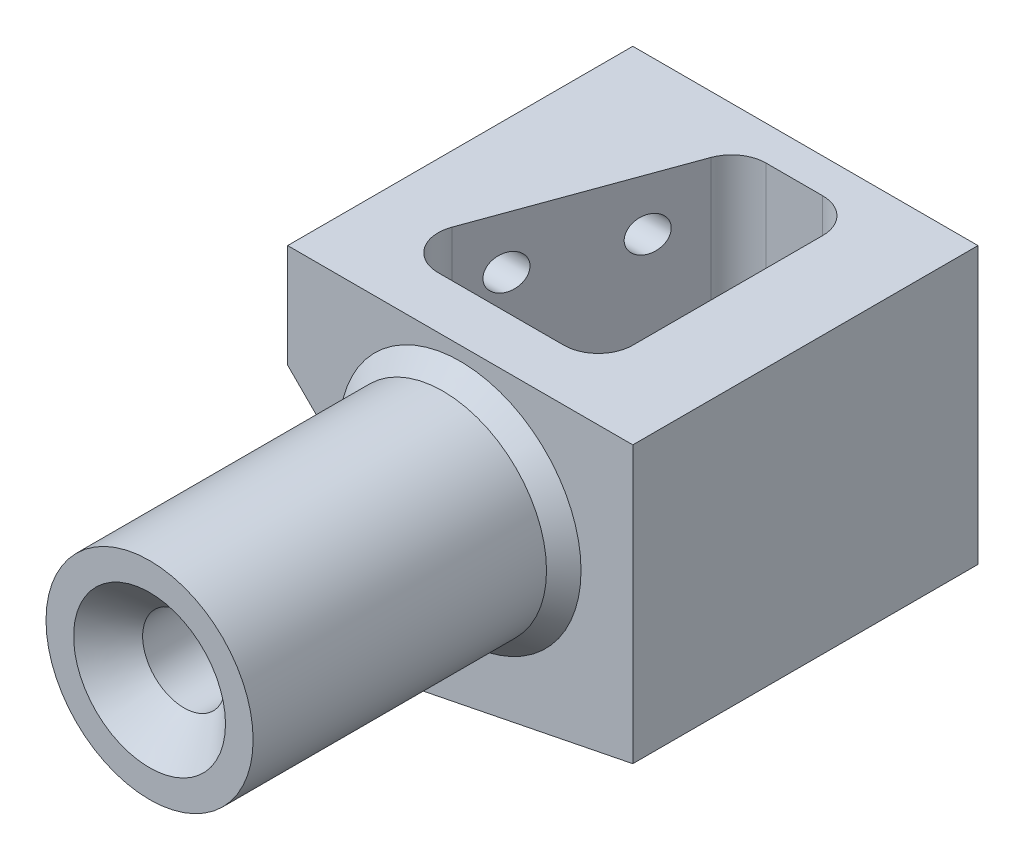
ISO-10303-21;
HEADER;
FILE_DESCRIPTION(('STEP AP214'),'2;1');
FILE_NAME('part.step','',(''),(''),'','','');
FILE_SCHEMA(('AUTOMOTIVE_DESIGN { 1 0 10303 214 1 1 1 1 }'));
ENDSEC;
DATA;
#1=APPLICATION_CONTEXT('core data for automotive mechanical design processes');
#2=APPLICATION_PROTOCOL_DEFINITION('international standard','automotive_design',2000,#1);
#3=PRODUCT_CONTEXT('',#1,'mechanical');
#4=PRODUCT('Part','Part','',(#3));
#5=PRODUCT_RELATED_PRODUCT_CATEGORY('part','',(#4));
#6=PRODUCT_DEFINITION_FORMATION('','',#4);
#7=PRODUCT_DEFINITION_CONTEXT('part definition',#1,'design');
#8=PRODUCT_DEFINITION('design','',#6,#7);
#9=PRODUCT_DEFINITION_SHAPE('','',#8);
#10=(LENGTH_UNIT() NAMED_UNIT(*) SI_UNIT(.MILLI.,.METRE.));
#11=(NAMED_UNIT(*) PLANE_ANGLE_UNIT() SI_UNIT($,.RADIAN.));
#12=(NAMED_UNIT(*) SI_UNIT($,.STERADIAN.) SOLID_ANGLE_UNIT());
#13=UNCERTAINTY_MEASURE_WITH_UNIT(LENGTH_MEASURE(1.E-05),#10,'distance_accuracy_value','');
#14=(GEOMETRIC_REPRESENTATION_CONTEXT(3) GLOBAL_UNCERTAINTY_ASSIGNED_CONTEXT((#13)) GLOBAL_UNIT_ASSIGNED_CONTEXT((#10,
#11,#12)) REPRESENTATION_CONTEXT('',''));
#15=CARTESIAN_POINT('',(0.,0.,0.));
#16=DIRECTION('',(0.,0.,1.));
#17=DIRECTION('',(1.,0.,0.));
#18=AXIS2_PLACEMENT_3D('',#15,#16,#17);
#19=CARTESIAN_POINT('',(0.,5.00000000000003,-10.));
#20=DIRECTION('',(0.,-1.,0.));
#21=DIRECTION('',(0.,0.,-1.));
#22=AXIS2_PLACEMENT_3D('',#19,#20,#21);
#23=PLANE('',#22);
#24=DIRECTION('',(1.,0.,0.));
#25=VECTOR('',#24,1.);
#26=CARTESIAN_POINT('',(0.,5.00000000000003,0.));
#27=LINE('',#26,#25);
#28=CARTESIAN_POINT('',(-4.99999999999998,5.00000000000003,0.));
#29=VERTEX_POINT('',#28);
#30=CARTESIAN_POINT('',(5.00000000000002,5.00000000000003,0.));
#31=VERTEX_POINT('',#30);
#32=EDGE_CURVE('E222',#29,#31,#27,.T.);
#33=ORIENTED_EDGE('',*,*,#32,.T.);
#34=DIRECTION('',(0.,0.,1.));
#35=VECTOR('',#34,1.);
#36=CARTESIAN_POINT('',(5.00000000000002,5.00000000000003,-10.));
#37=LINE('',#36,#35);
#38=CARTESIAN_POINT('',(5.00000000000002,5.00000000000003,-10.));
#39=VERTEX_POINT('',#38);
#40=EDGE_CURVE('E270',#39,#31,#37,.T.);
#41=ORIENTED_EDGE('',*,*,#40,.F.);
#42=DIRECTION('',(1.,0.,0.));
#43=VECTOR('',#42,1.);
#44=CARTESIAN_POINT('',(0.,5.00000000000003,-10.));
#45=LINE('',#44,#43);
#46=CARTESIAN_POINT('',(-4.99999999999998,5.00000000000003,-10.));
#47=VERTEX_POINT('',#46);
#48=EDGE_CURVE('E225',#47,#39,#45,.T.);
#49=ORIENTED_EDGE('',*,*,#48,.F.);
#50=DIRECTION('',(0.,0.,1.));
#51=VECTOR('',#50,1.);
#52=CARTESIAN_POINT('',(-4.99999999999998,5.00000000000003,-10.));
#53=LINE('',#52,#51);
#54=EDGE_CURVE('E242',#47,#29,#53,.T.);
#55=ORIENTED_EDGE('',*,*,#54,.T.);
#56=EDGE_LOOP('',(#33,#41,#49,#55));
#57=FACE_BOUND('',#56,.T.);
#58=CARTESIAN_POINT('',(1.5,5.00000000000003,-2.5));
#59=DIRECTION('',(0.,1.,0.));
#60=DIRECTION('',(0.,0.,-1.));
#61=AXIS2_PLACEMENT_3D('',#58,#59,#60);
#62=CIRCLE('',#61,1.);
#63=CARTESIAN_POINT('',(1.49999999999999,5.00000000000003,-1.5));
#64=VERTEX_POINT('',#63);
#65=CARTESIAN_POINT('',(2.5,5.00000000000003,-2.50000000000001));
#66=VERTEX_POINT('',#65);
#67=EDGE_CURVE('E68',#64,#66,#62,.T.);
#68=ORIENTED_EDGE('',*,*,#67,.F.);
#69=DIRECTION('',(1.,0.,0.));
#70=VECTOR('',#69,1.);
#71=CARTESIAN_POINT('',(0.,5.00000000000003,-1.5));
#72=LINE('',#71,#70);
#73=CARTESIAN_POINT('',(-2.14222201011317,5.00000000000003,-1.5));
#74=VERTEX_POINT('',#73);
#75=EDGE_CURVE('E194',#74,#64,#72,.T.);
#76=ORIENTED_EDGE('',*,*,#75,.F.);
#77=CARTESIAN_POINT('',(-2.14222201011317,5.00000000000003,-2.5));
#78=DIRECTION('',(0.,1.,0.));
#79=DIRECTION('',(0.,0.,1.));
#80=AXIS2_PLACEMENT_3D('',#77,#78,#79);
#81=CIRCLE('',#80,1.);
#82=CARTESIAN_POINT('',(-3.08191463089908,5.00000000000003,-2.84202014332568));
#83=VERTEX_POINT('',#82);
#84=EDGE_CURVE('E190',#83,#74,#81,.T.);
#85=ORIENTED_EDGE('',*,*,#84,.F.);
#86=DIRECTION('',(-0.342020143325669,0.,0.939692620785908));
#87=VECTOR('',#86,1.);
#88=CARTESIAN_POINT('',(-1.08007834243496,5.00000000000003,-8.34202014332567));
#89=LINE('',#88,#87);
#90=CARTESIAN_POINT('',(-1.08007834243496,5.00000000000003,-8.34202014332567));
#91=VERTEX_POINT('',#90);
#92=EDGE_CURVE('E184',#91,#83,#89,.T.);
#93=ORIENTED_EDGE('',*,*,#92,.F.);
#94=CARTESIAN_POINT('',(-0.140385721649054,5.00000000000003,-8.));
#95=DIRECTION('',(0.,1.,0.));
#96=DIRECTION('',(0.,0.,1.));
#97=AXIS2_PLACEMENT_3D('',#94,#95,#96);
#98=CIRCLE('',#97,1.);
#99=CARTESIAN_POINT('',(-0.140385721649049,5.00000000000003,-9.));
#100=VERTEX_POINT('',#99);
#101=EDGE_CURVE('E179',#100,#91,#98,.T.);
#102=ORIENTED_EDGE('',*,*,#101,.F.);
#103=DIRECTION('',(-1.,0.,0.));
#104=VECTOR('',#103,1.);
#105=CARTESIAN_POINT('',(1.49999999999999,5.00000000000003,-9.));
#106=LINE('',#105,#104);
#107=CARTESIAN_POINT('',(1.49999999999999,5.00000000000003,-9.));
#108=VERTEX_POINT('',#107);
#109=EDGE_CURVE('E175',#108,#100,#106,.T.);
#110=ORIENTED_EDGE('',*,*,#109,.F.);
#111=CARTESIAN_POINT('',(1.5,5.00000000000003,-8.));
#112=DIRECTION('',(0.,1.,0.));
#113=DIRECTION('',(0.,0.,1.));
#114=AXIS2_PLACEMENT_3D('',#111,#112,#113);
#115=CIRCLE('',#114,1.);
#116=CARTESIAN_POINT('',(2.5,5.00000000000003,-7.99999999999999));
#117=VERTEX_POINT('',#116);
#118=EDGE_CURVE('E154',#117,#108,#115,.T.);
#119=ORIENTED_EDGE('',*,*,#118,.F.);
#120=DIRECTION('',(0.,0.,-1.));
#121=VECTOR('',#120,1.);
#122=CARTESIAN_POINT('',(2.5,5.00000000000003,-4.));
#123=LINE('',#122,#121);
#124=EDGE_CURVE('E163',#66,#117,#123,.T.);
#125=ORIENTED_EDGE('',*,*,#124,.F.);
#126=EDGE_LOOP('',(#68,#76,#85,#93,#102,#110,#119,#125));
#127=FACE_BOUND('',#126,.T.);
#128=ADVANCED_FACE('F47',(#57,#127),#23,.F.);
#129=CARTESIAN_POINT('',(5.00000000000001,0.,-10.));
#130=DIRECTION('',(1.,0.,0.));
#131=DIRECTION('',(0.,1.,0.));
#132=AXIS2_PLACEMENT_3D('',#129,#130,#131);
#133=PLANE('',#132);
#134=DIRECTION('',(0.,1.,0.));
#135=VECTOR('',#134,1.);
#136=CARTESIAN_POINT('',(5.00000000000001,0.,0.));
#137=LINE('',#136,#135);
#138=CARTESIAN_POINT('',(5.,-3.,0.));
#139=VERTEX_POINT('',#138);
#140=EDGE_CURVE('E229',#139,#31,#137,.T.);
#141=ORIENTED_EDGE('',*,*,#140,.F.);
#142=DIRECTION('',(0.,0.,1.));
#143=VECTOR('',#142,1.);
#144=CARTESIAN_POINT('',(5.,-3.,-10.));
#145=LINE('',#144,#143);
#146=CARTESIAN_POINT('',(5.,-3.,-10.));
#147=VERTEX_POINT('',#146);
#148=EDGE_CURVE('E271',#147,#139,#145,.T.);
#149=ORIENTED_EDGE('',*,*,#148,.F.);
#150=DIRECTION('',(0.,1.,0.));
#151=VECTOR('',#150,1.);
#152=CARTESIAN_POINT('',(5.00000000000001,0.,-10.));
#153=LINE('',#152,#151);
#154=EDGE_CURVE('E244',#147,#39,#153,.T.);
#155=ORIENTED_EDGE('',*,*,#154,.T.);
#156=ORIENTED_EDGE('',*,*,#40,.T.);
#157=EDGE_LOOP('',(#141,#149,#155,#156));
#158=FACE_BOUND('',#157,.T.);
#159=ADVANCED_FACE('F337',(#158),#133,.T.);
#160=CARTESIAN_POINT('',(0.769230769230785,-3.84615384615386,-10.));
#161=DIRECTION('',(0.196116135138187,-0.98058067569092,0.));
#162=DIRECTION('',(0.98058067569092,0.196116135138187,0.));
#163=AXIS2_PLACEMENT_3D('',#160,#161,#162);
#164=PLANE('',#163);
#165=CARTESIAN_POINT('',(1.5,-3.70000000000001,-2.5));
#166=DIRECTION('',(0.196116135138187,-0.98058067569092,0.));
#167=DIRECTION('',(0.98058067569092,0.196116135138187,0.));
#168=AXIS2_PLACEMENT_3D('',#165,#166,#167);
#169=ELLIPSE('',#168,1.01980390271856,1.);
#170=CARTESIAN_POINT('',(2.5,-3.50000000000001,-2.50000000000001));
#171=VERTEX_POINT('',#170);
#172=CARTESIAN_POINT('',(1.49999999999999,-3.70000000000001,-1.5));
#173=VERTEX_POINT('',#172);
#174=EDGE_CURVE('E301',#171,#173,#169,.T.);
#175=ORIENTED_EDGE('',*,*,#174,.F.);
#176=DIRECTION('',(0.,0.,1.));
#177=VECTOR('',#176,1.);
#178=CARTESIAN_POINT('',(2.5,-3.50000000000001,-10.));
#179=LINE('',#178,#177);
#180=CARTESIAN_POINT('',(2.5,-3.50000000000001,-7.99999999999999));
#181=VERTEX_POINT('',#180);
#182=EDGE_CURVE('E269',#181,#171,#179,.T.);
#183=ORIENTED_EDGE('',*,*,#182,.F.);
#184=CARTESIAN_POINT('',(1.5,-3.70000000000001,-8.));
#185=DIRECTION('',(0.196116135138187,-0.98058067569092,0.));
#186=DIRECTION('',(0.98058067569092,0.196116135138187,0.));
#187=AXIS2_PLACEMENT_3D('',#184,#185,#186);
#188=ELLIPSE('',#187,1.01980390271856,1.);
#189=CARTESIAN_POINT('',(1.49999999999999,-3.70000000000001,-9.));
#190=VERTEX_POINT('',#189);
#191=EDGE_CURVE('E158',#190,#181,#188,.T.);
#192=ORIENTED_EDGE('',*,*,#191,.F.);
#193=DIRECTION('',(0.98058067569092,0.196116135138187,0.));
#194=VECTOR('',#193,1.);
#195=CARTESIAN_POINT('',(0.769230769230785,-3.84615384615386,-9.));
#196=LINE('',#195,#194);
#197=CARTESIAN_POINT('',(-0.140385721649049,-4.02807714432983,-9.));
#198=VERTEX_POINT('',#197);
#199=EDGE_CURVE('E286',#198,#190,#196,.T.);
#200=ORIENTED_EDGE('',*,*,#199,.F.);
#201=CARTESIAN_POINT('',(-0.140385721649054,-4.02807714432983,-8.));
#202=DIRECTION('',(0.196116135138187,-0.98058067569092,0.));
#203=DIRECTION('',(0.98058067569092,0.196116135138187,0.));
#204=AXIS2_PLACEMENT_3D('',#201,#202,#203);
#205=ELLIPSE('',#204,1.01980390271856,1.);
#206=CARTESIAN_POINT('',(-1.08007834243496,-4.21601566848701,-8.34202014332567));
#207=VERTEX_POINT('',#206);
#208=EDGE_CURVE('E291',#207,#198,#205,.T.);
#209=ORIENTED_EDGE('',*,*,#208,.F.);
#210=DIRECTION('',(0.341222765371186,0.0682445530742385,-0.937501842861195));
#211=VECTOR('',#210,1.);
#212=CARTESIAN_POINT('',(-0.325762222509179,-4.06515244450185,-10.4144866499524));
#213=LINE('',#212,#211);
#214=CARTESIAN_POINT('',(-3.08191463089908,-4.61638292617984,-2.84202014332568));
#215=VERTEX_POINT('',#214);
#216=EDGE_CURVE('E299',#215,#207,#213,.T.);
#217=ORIENTED_EDGE('',*,*,#216,.F.);
#218=CARTESIAN_POINT('',(-2.14222201011317,-4.42844440202266,-2.5));
#219=DIRECTION('',(0.196116135138187,-0.98058067569092,0.));
#220=DIRECTION('',(0.98058067569092,0.196116135138187,0.));
#221=AXIS2_PLACEMENT_3D('',#218,#219,#220);
#222=ELLIPSE('',#221,1.01980390271856,1.);
#223=CARTESIAN_POINT('',(-2.14222201011317,-4.42844440202266,-1.5));
#224=VERTEX_POINT('',#223);
#225=EDGE_CURVE('E298',#224,#215,#222,.T.);
#226=ORIENTED_EDGE('',*,*,#225,.F.);
#227=DIRECTION('',(-0.98058067569092,-0.196116135138187,0.));
#228=VECTOR('',#227,1.);
#229=CARTESIAN_POINT('',(0.769230769230784,-3.84615384615386,-1.5));
#230=LINE('',#229,#228);
#231=EDGE_CURVE('E304',#173,#224,#230,.T.);
#232=ORIENTED_EDGE('',*,*,#231,.F.);
#233=EDGE_LOOP('',(#175,#183,#192,#200,#209,#217,#226,#232));
#234=FACE_BOUND('',#233,.T.);
#235=DIRECTION('',(0.98058067569092,0.196116135138187,0.));
#236=VECTOR('',#235,1.);
#237=CARTESIAN_POINT('',(0.769230769230785,-3.84615384615386,0.));
#238=LINE('',#237,#236);
#239=CARTESIAN_POINT('',(-3.99999999999999,-4.80000000000003,0.));
#240=VERTEX_POINT('',#239);
#241=EDGE_CURVE('E257',#240,#139,#238,.T.);
#242=ORIENTED_EDGE('',*,*,#241,.F.);
#243=DIRECTION('',(0.,0.,1.));
#244=VECTOR('',#243,1.);
#245=CARTESIAN_POINT('',(-3.99999999999999,-4.80000000000003,-10.));
#246=LINE('',#245,#244);
#247=CARTESIAN_POINT('',(-3.99999999999999,-4.80000000000003,-10.));
#248=VERTEX_POINT('',#247);
#249=EDGE_CURVE('E273',#248,#240,#246,.T.);
#250=ORIENTED_EDGE('',*,*,#249,.F.);
#251=DIRECTION('',(0.98058067569092,0.196116135138187,0.));
#252=VECTOR('',#251,1.);
#253=CARTESIAN_POINT('',(0.769230769230785,-3.84615384615386,-10.));
#254=LINE('',#253,#252);
#255=EDGE_CURVE('E240',#248,#147,#254,.T.);
#256=ORIENTED_EDGE('',*,*,#255,.T.);
#257=ORIENTED_EDGE('',*,*,#148,.T.);
#258=EDGE_LOOP('',(#242,#250,#256,#257));
#259=FACE_BOUND('',#258,.T.);
#260=ADVANCED_FACE('F350',(#234,#259),#164,.T.);
#261=CARTESIAN_POINT('',(-3.99999999999998,0.,-10.));
#262=DIRECTION('',(-1.,0.,0.));
#263=DIRECTION('',(0.,-1.,0.));
#264=AXIS2_PLACEMENT_3D('',#261,#262,#263);
#265=PLANE('',#264);
#266=DIRECTION('',(0.,-1.,0.));
#267=VECTOR('',#266,1.);
#268=CARTESIAN_POINT('',(-3.99999999999998,0.,0.));
#269=LINE('',#268,#267);
#270=CARTESIAN_POINT('',(-3.99999999999998,1.00000000000002,0.));
#271=VERTEX_POINT('',#270);
#272=EDGE_CURVE('E258',#271,#240,#269,.T.);
#273=ORIENTED_EDGE('',*,*,#272,.F.);
#274=DIRECTION('',(0.,0.,1.));
#275=VECTOR('',#274,1.);
#276=CARTESIAN_POINT('',(-3.99999999999998,1.00000000000002,-10.));
#277=LINE('',#276,#275);
#278=CARTESIAN_POINT('',(-3.99999999999998,1.00000000000002,-10.));
#279=VERTEX_POINT('',#278);
#280=EDGE_CURVE('E280',#279,#271,#277,.T.);
#281=ORIENTED_EDGE('',*,*,#280,.F.);
#282=DIRECTION('',(0.,-1.,0.));
#283=VECTOR('',#282,1.);
#284=CARTESIAN_POINT('',(-3.99999999999998,0.,-10.));
#285=LINE('',#284,#283);
#286=EDGE_CURVE('E232',#279,#248,#285,.T.);
#287=ORIENTED_EDGE('',*,*,#286,.T.);
#288=ORIENTED_EDGE('',*,*,#249,.T.);
#289=EDGE_LOOP('',(#273,#281,#287,#288));
#290=FACE_BOUND('',#289,.T.);
#291=ADVANCED_FACE('F360',(#290),#265,.T.);
#292=CARTESIAN_POINT('',(-1.50000000000002,-1.49999999999999,-10.));
#293=DIRECTION('',(-0.707106781186555,-0.70710678118654,0.));
#294=DIRECTION('',(0.70710678118654,-0.707106781186555,0.));
#295=AXIS2_PLACEMENT_3D('',#292,#293,#294);
#296=PLANE('',#295);
#297=DIRECTION('',(0.70710678118654,-0.707106781186555,0.));
#298=VECTOR('',#297,1.);
#299=CARTESIAN_POINT('',(-1.50000000000002,-1.49999999999999,0.));
#300=LINE('',#299,#298);
#301=CARTESIAN_POINT('',(-4.99999999999997,2.00000000000003,0.));
#302=VERTEX_POINT('',#301);
#303=EDGE_CURVE('E252',#302,#271,#300,.T.);
#304=ORIENTED_EDGE('',*,*,#303,.F.);
#305=DIRECTION('',(0.,0.,1.));
#306=VECTOR('',#305,1.);
#307=CARTESIAN_POINT('',(-4.99999999999997,2.00000000000003,-10.));
#308=LINE('',#307,#306);
#309=CARTESIAN_POINT('',(-4.99999999999997,2.00000000000003,-10.));
#310=VERTEX_POINT('',#309);
#311=EDGE_CURVE('E278',#310,#302,#308,.T.);
#312=ORIENTED_EDGE('',*,*,#311,.F.);
#313=DIRECTION('',(0.70710678118654,-0.707106781186555,0.));
#314=VECTOR('',#313,1.);
#315=CARTESIAN_POINT('',(-1.50000000000002,-1.49999999999999,-10.));
#316=LINE('',#315,#314);
#317=EDGE_CURVE('E228',#310,#279,#316,.T.);
#318=ORIENTED_EDGE('',*,*,#317,.T.);
#319=ORIENTED_EDGE('',*,*,#280,.T.);
#320=EDGE_LOOP('',(#304,#312,#318,#319));
#321=FACE_BOUND('',#320,.T.);
#322=ADVANCED_FACE('F352',(#321),#296,.T.);
#323=CARTESIAN_POINT('',(-4.99999999999996,0.,-10.));
#324=DIRECTION('',(1.,0.,0.));
#325=DIRECTION('',(0.,1.,0.));
#326=AXIS2_PLACEMENT_3D('',#323,#324,#325);
#327=PLANE('',#326);
#328=CARTESIAN_POINT('',(-4.99999999999998,3.50000000000003,-7.));
#329=DIRECTION('',(-1.,0.,0.));
#330=DIRECTION('',(0.,-1.,0.));
#331=AXIS2_PLACEMENT_3D('',#328,#329,#330);
#332=CIRCLE('',#331,0.500000000000001);
#333=CARTESIAN_POINT('',(-4.99999999999997,3.00000000000003,-7.));
#334=VERTEX_POINT('',#333);
#335=EDGE_CURVE('E315',#334,#334,#332,.T.);
#336=ORIENTED_EDGE('',*,*,#335,.F.);
#337=EDGE_LOOP('',(#336));
#338=FACE_BOUND('',#337,.T.);
#339=CARTESIAN_POINT('',(-4.99999999999998,3.50000000000003,-4.));
#340=DIRECTION('',(-1.,0.,0.));
#341=DIRECTION('',(0.,-1.,0.));
#342=AXIS2_PLACEMENT_3D('',#339,#340,#341);
#343=CIRCLE('',#342,0.5);
#344=CARTESIAN_POINT('',(-4.99999999999997,3.00000000000003,-4.));
#345=VERTEX_POINT('',#344);
#346=EDGE_CURVE('E426',#345,#345,#343,.T.);
#347=ORIENTED_EDGE('',*,*,#346,.F.);
#348=EDGE_LOOP('',(#347));
#349=FACE_BOUND('',#348,.T.);
#350=DIRECTION('',(0.,1.,0.));
#351=VECTOR('',#350,1.);
#352=CARTESIAN_POINT('',(-4.99999999999996,0.,0.));
#353=LINE('',#352,#351);
#354=EDGE_CURVE('E250',#302,#29,#353,.T.);
#355=ORIENTED_EDGE('',*,*,#354,.T.);
#356=ORIENTED_EDGE('',*,*,#54,.F.);
#357=DIRECTION('',(0.,1.,0.));
#358=VECTOR('',#357,1.);
#359=CARTESIAN_POINT('',(-4.99999999999996,0.,-10.));
#360=LINE('',#359,#358);
#361=EDGE_CURVE('E223',#310,#47,#360,.T.);
#362=ORIENTED_EDGE('',*,*,#361,.F.);
#363=ORIENTED_EDGE('',*,*,#311,.T.);
#364=EDGE_LOOP('',(#355,#356,#362,#363));
#365=FACE_BOUND('',#364,.T.);
#366=ADVANCED_FACE('F354',(#338,#349,#365),#327,.F.);
#367=CARTESIAN_POINT('',(0.,0.,-10.));
#368=DIRECTION('',(0.,0.,1.));
#369=DIRECTION('',(1.,0.,0.));
#370=AXIS2_PLACEMENT_3D('',#367,#368,#369);
#371=PLANE('',#370);
#372=ORIENTED_EDGE('',*,*,#48,.T.);
#373=ORIENTED_EDGE('',*,*,#154,.F.);
#374=ORIENTED_EDGE('',*,*,#255,.F.);
#375=ORIENTED_EDGE('',*,*,#286,.F.);
#376=ORIENTED_EDGE('',*,*,#317,.F.);
#377=ORIENTED_EDGE('',*,*,#361,.T.);
#378=EDGE_LOOP('',(#372,#373,#374,#375,#376,#377));
#379=FACE_BOUND('',#378,.T.);
#380=ADVANCED_FACE('F353',(#379),#371,.F.);
#381=CARTESIAN_POINT('',(0.,0.,0.));
#382=DIRECTION('',(0.,0.,1.));
#383=DIRECTION('',(1.,0.,0.));
#384=AXIS2_PLACEMENT_3D('',#381,#382,#383);
#385=PLANE('',#384);
#386=CARTESIAN_POINT('',(0.,1.09901951359279,0.));
#387=DIRECTION('',(0.,0.,1.));
#388=DIRECTION('',(1.,0.,0.));
#389=AXIS2_PLACEMENT_3D('',#386,#387,#388);
#390=CIRCLE('',#389,3.50000000000003);
#391=CARTESIAN_POINT('',(3.50000000000003,1.09901951359279,0.));
#392=VERTEX_POINT('',#391);
#393=EDGE_CURVE('E11',#392,#392,#390,.F.);
#394=ORIENTED_EDGE('',*,*,#393,.T.);
#395=EDGE_LOOP('',(#394));
#396=FACE_BOUND('',#395,.T.);
#397=ORIENTED_EDGE('',*,*,#32,.F.);
#398=ORIENTED_EDGE('',*,*,#354,.F.);
#399=ORIENTED_EDGE('',*,*,#303,.T.);
#400=ORIENTED_EDGE('',*,*,#272,.T.);
#401=ORIENTED_EDGE('',*,*,#241,.T.);
#402=ORIENTED_EDGE('',*,*,#140,.T.);
#403=EDGE_LOOP('',(#397,#398,#399,#400,#401,#402));
#404=FACE_BOUND('',#403,.T.);
#405=ADVANCED_FACE('F368',(#396,#404),#385,.T.);
#406=CARTESIAN_POINT('',(0.,1.09901951359279,9.));
#407=DIRECTION('',(0.,0.,-1.));
#408=DIRECTION('',(-1.,0.,0.));
#409=AXIS2_PLACEMENT_3D('',#406,#407,#408);
#410=CYLINDRICAL_SURFACE('',#409,3.00000000000003);
#411=CARTESIAN_POINT('',(0.,1.09901951359279,0.500000000000004));
#412=DIRECTION('',(0.,0.,1.));
#413=DIRECTION('',(1.,0.,0.));
#414=AXIS2_PLACEMENT_3D('',#411,#412,#413);
#415=CIRCLE('',#414,3.00000000000003);
#416=CARTESIAN_POINT('',(3.00000000000003,1.09901951359279,0.500000000000004));
#417=VERTEX_POINT('',#416);
#418=EDGE_CURVE('E56',#417,#417,#415,.T.);
#419=ORIENTED_EDGE('',*,*,#418,.T.);
#420=EDGE_LOOP('',(#419));
#421=FACE_BOUND('',#420,.T.);
#422=CARTESIAN_POINT('',(0.,1.09901951359279,9.));
#423=DIRECTION('',(0.,0.,1.));
#424=DIRECTION('',(1.,0.,0.));
#425=AXIS2_PLACEMENT_3D('',#422,#423,#424);
#426=CIRCLE('',#425,3.00000000000003);
#427=CARTESIAN_POINT('',(3.00000000000003,1.09901951359279,9.));
#428=VERTEX_POINT('',#427);
#429=EDGE_CURVE('E199',#428,#428,#426,.T.);
#430=ORIENTED_EDGE('',*,*,#429,.F.);
#431=EDGE_LOOP('',(#430));
#432=FACE_BOUND('',#431,.T.);
#433=ADVANCED_FACE('F317',(#421,#432),#410,.T.);
#434=CARTESIAN_POINT('',(0.,0.,9.));
#435=DIRECTION('',(0.,0.,1.));
#436=DIRECTION('',(1.,0.,0.));
#437=AXIS2_PLACEMENT_3D('',#434,#435,#436);
#438=PLANE('',#437);
#439=CARTESIAN_POINT('',(0.,1.09901951359279,9.));
#440=DIRECTION('',(0.,0.,1.));
#441=DIRECTION('',(1.,0.,0.));
#442=AXIS2_PLACEMENT_3D('',#439,#440,#441);
#443=CIRCLE('',#442,2.2);
#444=CARTESIAN_POINT('',(2.2,1.09901951359279,9.));
#445=VERTEX_POINT('',#444);
#446=EDGE_CURVE('E418',#445,#445,#443,.T.);
#447=ORIENTED_EDGE('',*,*,#446,.F.);
#448=EDGE_LOOP('',(#447));
#449=FACE_BOUND('',#448,.T.);
#450=ORIENTED_EDGE('',*,*,#429,.T.);
#451=EDGE_LOOP('',(#450));
#452=FACE_BOUND('',#451,.T.);
#453=ADVANCED_FACE('F373',(#449,#452),#438,.T.);
#454=CARTESIAN_POINT('',(1.5,-4.99999999999997,-2.5));
#455=DIRECTION('',(0.,1.,0.));
#456=DIRECTION('',(0.,0.,1.));
#457=AXIS2_PLACEMENT_3D('',#454,#455,#456);
#458=CYLINDRICAL_SURFACE('',#457,1.);
#459=ORIENTED_EDGE('',*,*,#174,.T.);
#460=DIRECTION('',(0.,1.,0.));
#461=VECTOR('',#460,1.);
#462=CARTESIAN_POINT('',(1.49999999999999,-4.99999999999997,-1.5));
#463=LINE('',#462,#461);
#464=EDGE_CURVE('E203',#173,#64,#463,.T.);
#465=ORIENTED_EDGE('',*,*,#464,.T.);
#466=ORIENTED_EDGE('',*,*,#67,.T.);
#467=DIRECTION('',(0.,1.,0.));
#468=VECTOR('',#467,1.);
#469=CARTESIAN_POINT('',(2.5,-4.99999999999997,-2.50000000000001));
#470=LINE('',#469,#468);
#471=EDGE_CURVE('E167',#171,#66,#470,.T.);
#472=ORIENTED_EDGE('',*,*,#471,.F.);
#473=EDGE_LOOP('',(#459,#465,#466,#472));
#474=FACE_BOUND('',#473,.T.);
#475=ADVANCED_FACE('F374',(#474),#458,.F.);
#476=CARTESIAN_POINT('',(0.,-4.99999999999997,-1.5));
#477=DIRECTION('',(0.,0.,1.));
#478=DIRECTION('',(1.,0.,0.));
#479=AXIS2_PLACEMENT_3D('',#476,#477,#478);
#480=PLANE('',#479);
#481=CARTESIAN_POINT('',(0.,1.09901951359279,-1.5));
#482=DIRECTION('',(0.,0.,1.));
#483=DIRECTION('',(1.,0.,0.));
#484=AXIS2_PLACEMENT_3D('',#481,#482,#483);
#485=CIRCLE('',#484,1.2);
#486=CARTESIAN_POINT('',(1.2,1.09901951359279,-1.5));
#487=VERTEX_POINT('',#486);
#488=EDGE_CURVE('E419',#487,#487,#485,.T.);
#489=ORIENTED_EDGE('',*,*,#488,.T.);
#490=EDGE_LOOP('',(#489));
#491=FACE_BOUND('',#490,.T.);
#492=ORIENTED_EDGE('',*,*,#231,.T.);
#493=DIRECTION('',(0.,1.,0.));
#494=VECTOR('',#493,1.);
#495=CARTESIAN_POINT('',(-2.14222201011317,-4.99999999999997,-1.5));
#496=LINE('',#495,#494);
#497=EDGE_CURVE('E204',#224,#74,#496,.T.);
#498=ORIENTED_EDGE('',*,*,#497,.T.);
#499=ORIENTED_EDGE('',*,*,#75,.T.);
#500=ORIENTED_EDGE('',*,*,#464,.F.);
#501=EDGE_LOOP('',(#492,#498,#499,#500));
#502=FACE_BOUND('',#501,.T.);
#503=ADVANCED_FACE('F398',(#491,#502),#480,.F.);
#504=CARTESIAN_POINT('',(-2.14222201011317,-4.99999999999997,-2.5));
#505=DIRECTION('',(0.,1.,0.));
#506=DIRECTION('',(0.,0.,1.));
#507=AXIS2_PLACEMENT_3D('',#504,#505,#506);
#508=CYLINDRICAL_SURFACE('',#507,1.);
#509=ORIENTED_EDGE('',*,*,#225,.T.);
#510=DIRECTION('',(0.,1.,0.));
#511=VECTOR('',#510,1.);
#512=CARTESIAN_POINT('',(-3.08191463089908,-4.99999999999997,-2.84202014332568));
#513=LINE('',#512,#511);
#514=EDGE_CURVE('E210',#215,#83,#513,.T.);
#515=ORIENTED_EDGE('',*,*,#514,.T.);
#516=ORIENTED_EDGE('',*,*,#84,.T.);
#517=ORIENTED_EDGE('',*,*,#497,.F.);
#518=EDGE_LOOP('',(#509,#515,#516,#517));
#519=FACE_BOUND('',#518,.T.);
#520=ADVANCED_FACE('F391',(#519),#508,.F.);
#521=CARTESIAN_POINT('',(-1.08007834243496,-4.99999999999997,-8.34202014332567));
#522=DIRECTION('',(-0.939692620785908,0.,-0.342020143325669));
#523=DIRECTION('',(-0.342020143325669,0.,0.939692620785908));
#524=AXIS2_PLACEMENT_3D('',#521,#522,#523);
#525=PLANE('',#524);
#526=CARTESIAN_POINT('',(-1.56853372839117,3.50000000000005,-7.));
#527=DIRECTION('',(-0.939692620785908,0.,-0.342020143325669));
#528=DIRECTION('',(-0.342020143325669,0.,0.939692620785908));
#529=AXIS2_PLACEMENT_3D('',#526,#527,#528);
#530=ELLIPSE('',#529,0.532088886237957,0.500000000000001);
#531=CARTESIAN_POINT('',(-1.75051884552427,3.50000000000004,-6.5));
#532=VERTEX_POINT('',#531);
#533=EDGE_CURVE('E166',#532,#532,#530,.T.);
#534=ORIENTED_EDGE('',*,*,#533,.T.);
#535=EDGE_LOOP('',(#534));
#536=FACE_BOUND('',#535,.T.);
#537=CARTESIAN_POINT('',(-2.66044443118978,3.50000000000004,-4.));
#538=DIRECTION('',(-0.939692620785908,0.,-0.342020143325669));
#539=DIRECTION('',(-0.342020143325669,0.,0.939692620785908));
#540=AXIS2_PLACEMENT_3D('',#537,#538,#539);
#541=ELLIPSE('',#540,0.532088886237956,0.5);
#542=CARTESIAN_POINT('',(-2.84242954832288,3.50000000000004,-3.5));
#543=VERTEX_POINT('',#542);
#544=EDGE_CURVE('E306',#543,#543,#541,.T.);
#545=ORIENTED_EDGE('',*,*,#544,.T.);
#546=EDGE_LOOP('',(#545));
#547=FACE_BOUND('',#546,.T.);
#548=ORIENTED_EDGE('',*,*,#216,.T.);
#549=DIRECTION('',(0.,1.,0.));
#550=VECTOR('',#549,1.);
#551=CARTESIAN_POINT('',(-1.08007834243496,-4.99999999999997,-8.34202014332567));
#552=LINE('',#551,#550);
#553=EDGE_CURVE('E209',#207,#91,#552,.T.);
#554=ORIENTED_EDGE('',*,*,#553,.T.);
#555=ORIENTED_EDGE('',*,*,#92,.T.);
#556=ORIENTED_EDGE('',*,*,#514,.F.);
#557=EDGE_LOOP('',(#548,#554,#555,#556));
#558=FACE_BOUND('',#557,.T.);
#559=ADVANCED_FACE('F389',(#536,#547,#558),#525,.F.);
#560=CARTESIAN_POINT('',(-0.140385721649054,-4.99999999999997,-8.));
#561=DIRECTION('',(0.,1.,0.));
#562=DIRECTION('',(0.,0.,1.));
#563=AXIS2_PLACEMENT_3D('',#560,#561,#562);
#564=CYLINDRICAL_SURFACE('',#563,1.);
#565=ORIENTED_EDGE('',*,*,#208,.T.);
#566=DIRECTION('',(0.,1.,0.));
#567=VECTOR('',#566,1.);
#568=CARTESIAN_POINT('',(-0.140385721649049,-4.99999999999997,-9.));
#569=LINE('',#568,#567);
#570=EDGE_CURVE('E213',#198,#100,#569,.T.);
#571=ORIENTED_EDGE('',*,*,#570,.T.);
#572=ORIENTED_EDGE('',*,*,#101,.T.);
#573=ORIENTED_EDGE('',*,*,#553,.F.);
#574=EDGE_LOOP('',(#565,#571,#572,#573));
#575=FACE_BOUND('',#574,.T.);
#576=ADVANCED_FACE('F383',(#575),#564,.F.);
#577=CARTESIAN_POINT('',(1.49999999999999,-4.99999999999997,-9.));
#578=DIRECTION('',(0.,0.,-1.));
#579=DIRECTION('',(-1.,0.,0.));
#580=AXIS2_PLACEMENT_3D('',#577,#578,#579);
#581=PLANE('',#580);
#582=ORIENTED_EDGE('',*,*,#199,.T.);
#583=DIRECTION('',(0.,1.,0.));
#584=VECTOR('',#583,1.);
#585=CARTESIAN_POINT('',(1.49999999999999,-4.99999999999997,-9.));
#586=LINE('',#585,#584);
#587=EDGE_CURVE('E161',#190,#108,#586,.T.);
#588=ORIENTED_EDGE('',*,*,#587,.T.);
#589=ORIENTED_EDGE('',*,*,#109,.T.);
#590=ORIENTED_EDGE('',*,*,#570,.F.);
#591=EDGE_LOOP('',(#582,#588,#589,#590));
#592=FACE_BOUND('',#591,.T.);
#593=ADVANCED_FACE('F381',(#592),#581,.F.);
#594=CARTESIAN_POINT('',(1.5,-4.99999999999997,-8.));
#595=DIRECTION('',(0.,1.,0.));
#596=DIRECTION('',(0.,0.,1.));
#597=AXIS2_PLACEMENT_3D('',#594,#595,#596);
#598=CYLINDRICAL_SURFACE('',#597,1.);
#599=ORIENTED_EDGE('',*,*,#191,.T.);
#600=DIRECTION('',(0.,1.,0.));
#601=VECTOR('',#600,1.);
#602=CARTESIAN_POINT('',(2.5,-4.99999999999997,-7.99999999999999));
#603=LINE('',#602,#601);
#604=EDGE_CURVE('E74',#181,#117,#603,.T.);
#605=ORIENTED_EDGE('',*,*,#604,.T.);
#606=ORIENTED_EDGE('',*,*,#118,.T.);
#607=ORIENTED_EDGE('',*,*,#587,.F.);
#608=EDGE_LOOP('',(#599,#605,#606,#607));
#609=FACE_BOUND('',#608,.T.);
#610=ADVANCED_FACE('F155',(#609),#598,.F.);
#611=CARTESIAN_POINT('',(2.5,-4.99999999999997,-4.));
#612=DIRECTION('',(1.,0.,0.));
#613=DIRECTION('',(0.,0.,-1.));
#614=AXIS2_PLACEMENT_3D('',#611,#612,#613);
#615=PLANE('',#614);
#616=ORIENTED_EDGE('',*,*,#182,.T.);
#617=ORIENTED_EDGE('',*,*,#471,.T.);
#618=ORIENTED_EDGE('',*,*,#124,.T.);
#619=ORIENTED_EDGE('',*,*,#604,.F.);
#620=EDGE_LOOP('',(#616,#617,#618,#619));
#621=FACE_BOUND('',#620,.T.);
#622=ADVANCED_FACE('F164',(#621),#615,.F.);
#623=CARTESIAN_POINT('',(0.,3.50000000000006,-4.));
#624=DIRECTION('',(-1.,0.,0.));
#625=DIRECTION('',(0.,-1.,0.));
#626=AXIS2_PLACEMENT_3D('',#623,#624,#625);
#627=CYLINDRICAL_SURFACE('',#626,0.5);
#628=ORIENTED_EDGE('',*,*,#346,.T.);
#629=EDGE_LOOP('',(#628));
#630=FACE_BOUND('',#629,.T.);
#631=ORIENTED_EDGE('',*,*,#544,.F.);
#632=EDGE_LOOP('',(#631));
#633=FACE_BOUND('',#632,.T.);
#634=ADVANCED_FACE('F333',(#630,#633),#627,.F.);
#635=CARTESIAN_POINT('',(0.,3.50000000000005,-7.));
#636=DIRECTION('',(-1.,0.,0.));
#637=DIRECTION('',(0.,-1.,0.));
#638=AXIS2_PLACEMENT_3D('',#635,#636,#637);
#639=CYLINDRICAL_SURFACE('',#638,0.500000000000001);
#640=ORIENTED_EDGE('',*,*,#335,.T.);
#641=EDGE_LOOP('',(#640));
#642=FACE_BOUND('',#641,.T.);
#643=ORIENTED_EDGE('',*,*,#533,.F.);
#644=EDGE_LOOP('',(#643));
#645=FACE_BOUND('',#644,.T.);
#646=ADVANCED_FACE('F322',(#642,#645),#639,.F.);
#647=CARTESIAN_POINT('',(0.,1.09901951359279,0.500000000000004));
#648=DIRECTION('',(0.,0.,-1.));
#649=DIRECTION('',(-1.,0.,0.));
#650=AXIS2_PLACEMENT_3D('',#647,#648,#649);
#651=CONICAL_SURFACE('',#650,3.00000000000003,0.785398163397442);
#652=ORIENTED_EDGE('',*,*,#393,.F.);
#653=EDGE_LOOP('',(#652));
#654=FACE_BOUND('',#653,.T.);
#655=ORIENTED_EDGE('',*,*,#418,.F.);
#656=EDGE_LOOP('',(#655));
#657=FACE_BOUND('',#656,.T.);
#658=ADVANCED_FACE('F55',(#654,#657),#651,.T.);
#659=CARTESIAN_POINT('',(0.,1.09901951359279,9.));
#660=DIRECTION('',(0.,0.,1.));
#661=DIRECTION('',(1.,0.,0.));
#662=AXIS2_PLACEMENT_3D('',#659,#660,#661);
#663=CYLINDRICAL_SURFACE('',#662,1.2);
#664=ORIENTED_EDGE('',*,*,#488,.F.);
#665=EDGE_LOOP('',(#664));
#666=FACE_BOUND('',#665,.T.);
#667=CARTESIAN_POINT('',(0.,1.09901951359279,8.));
#668=DIRECTION('',(0.,0.,1.));
#669=DIRECTION('',(1.,0.,0.));
#670=AXIS2_PLACEMENT_3D('',#667,#668,#669);
#671=CIRCLE('',#670,1.2);
#672=CARTESIAN_POINT('',(1.2,1.09901951359279,8.));
#673=VERTEX_POINT('',#672);
#674=EDGE_CURVE('E412',#673,#673,#671,.T.);
#675=ORIENTED_EDGE('',*,*,#674,.T.);
#676=EDGE_LOOP('',(#675));
#677=FACE_BOUND('',#676,.T.);
#678=ADVANCED_FACE('F323',(#666,#677),#663,.F.);
#679=CARTESIAN_POINT('',(0.,1.09901951359279,9.));
#680=DIRECTION('',(0.,0.,1.));
#681=DIRECTION('',(1.,0.,0.));
#682=AXIS2_PLACEMENT_3D('',#679,#680,#681);
#683=CONICAL_SURFACE('',#682,2.2,0.785398163397447);
#684=ORIENTED_EDGE('',*,*,#674,.F.);
#685=EDGE_LOOP('',(#684));
#686=FACE_BOUND('',#685,.T.);
#687=ORIENTED_EDGE('',*,*,#446,.T.);
#688=EDGE_LOOP('',(#687));
#689=FACE_BOUND('',#688,.T.);
#690=ADVANCED_FACE('F332',(#686,#689),#683,.F.);
#691=CLOSED_SHELL('',(#128,#159,#260,#291,#322,#366,#380,#405,#433,#453,#475,#503,#520,#559,
#576,#593,#610,#622,#634,#646,#658,#678,#690));
#692=MANIFOLD_SOLID_BREP('B2',#691);
#693=ADVANCED_BREP_SHAPE_REPRESENTATION('',(#18,#692),#14);
#694=SHAPE_DEFINITION_REPRESENTATION(#9,#693);
ENDSEC;
END-ISO-10303-21;
